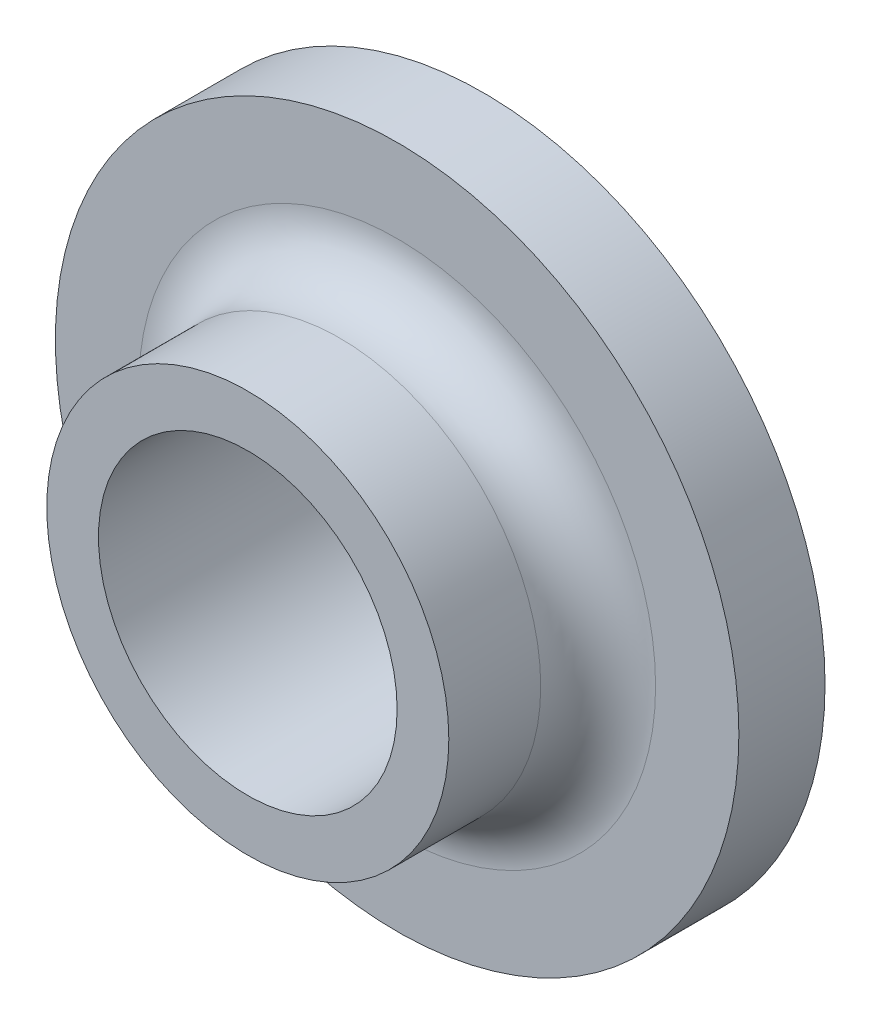
ISO-10303-21;
HEADER;
FILE_DESCRIPTION(('STEP AP214'),'2;1');
FILE_NAME('part.step','',(''),(''),'','','');
FILE_SCHEMA(('AUTOMOTIVE_DESIGN { 1 0 10303 214 1 1 1 1 }'));
ENDSEC;
DATA;
#1=APPLICATION_CONTEXT('core data for automotive mechanical design processes');
#2=APPLICATION_PROTOCOL_DEFINITION('international standard','automotive_design',2000,#1);
#3=PRODUCT_CONTEXT('',#1,'mechanical');
#4=PRODUCT('Part','Part','',(#3));
#5=PRODUCT_RELATED_PRODUCT_CATEGORY('part','',(#4));
#6=PRODUCT_DEFINITION_FORMATION('','',#4);
#7=PRODUCT_DEFINITION_CONTEXT('part definition',#1,'design');
#8=PRODUCT_DEFINITION('design','',#6,#7);
#9=PRODUCT_DEFINITION_SHAPE('','',#8);
#10=(LENGTH_UNIT() NAMED_UNIT(*) SI_UNIT(.MILLI.,.METRE.));
#11=(NAMED_UNIT(*) PLANE_ANGLE_UNIT() SI_UNIT($,.RADIAN.));
#12=(NAMED_UNIT(*) SI_UNIT($,.STERADIAN.) SOLID_ANGLE_UNIT());
#13=UNCERTAINTY_MEASURE_WITH_UNIT(LENGTH_MEASURE(1.E-05),#10,'distance_accuracy_value','');
#14=(GEOMETRIC_REPRESENTATION_CONTEXT(3) GLOBAL_UNCERTAINTY_ASSIGNED_CONTEXT((#13)) GLOBAL_UNIT_ASSIGNED_CONTEXT((#10,
#11,#12)) REPRESENTATION_CONTEXT('',''));
#15=CARTESIAN_POINT('',(0.,0.,0.));
#16=DIRECTION('',(0.,0.,1.));
#17=DIRECTION('',(1.,0.,0.));
#18=AXIS2_PLACEMENT_3D('',#15,#16,#17);
#19=CARTESIAN_POINT('',(0.,0.,1.5));
#20=DIRECTION('',(0.,0.,1.));
#21=DIRECTION('',(1.,0.,0.));
#22=AXIS2_PLACEMENT_3D('',#19,#20,#21);
#23=PLANE('',#22);
#24=CARTESIAN_POINT('',(0.,0.,1.5));
#25=DIRECTION('',(0.,0.,1.));
#26=DIRECTION('',(1.,0.,0.));
#27=AXIS2_PLACEMENT_3D('',#24,#25,#26);
#28=CIRCLE('',#27,4.5);
#29=CARTESIAN_POINT('',(4.5,0.,1.5));
#30=VERTEX_POINT('',#29);
#31=EDGE_CURVE('E10',#30,#30,#28,.F.);
#32=ORIENTED_EDGE('',*,*,#31,.T.);
#33=EDGE_LOOP('',(#32));
#34=FACE_BOUND('',#33,.T.);
#35=CARTESIAN_POINT('',(0.,0.,1.5));
#36=DIRECTION('',(0.,0.,1.));
#37=DIRECTION('',(1.,0.,0.));
#38=AXIS2_PLACEMENT_3D('',#35,#36,#37);
#39=CIRCLE('',#38,5.95);
#40=CARTESIAN_POINT('',(5.95,0.,1.5));
#41=VERTEX_POINT('',#40);
#42=EDGE_CURVE('E52',#41,#41,#39,.T.);
#43=ORIENTED_EDGE('',*,*,#42,.T.);
#44=EDGE_LOOP('',(#43));
#45=FACE_BOUND('',#44,.T.);
#46=ADVANCED_FACE('F41',(#34,#45),#23,.T.);
#47=CARTESIAN_POINT('',(0.,0.,0.));
#48=DIRECTION('',(0.,0.,1.));
#49=DIRECTION('',(1.,0.,0.));
#50=AXIS2_PLACEMENT_3D('',#47,#48,#49);
#51=PLANE('',#50);
#52=CARTESIAN_POINT('',(0.,0.,0.));
#53=DIRECTION('',(0.,0.,1.));
#54=DIRECTION('',(1.,0.,0.));
#55=AXIS2_PLACEMENT_3D('',#52,#53,#54);
#56=CIRCLE('',#55,2.6);
#57=CARTESIAN_POINT('',(2.6,0.,0.));
#58=VERTEX_POINT('',#57);
#59=EDGE_CURVE('E65',#58,#58,#56,.T.);
#60=ORIENTED_EDGE('',*,*,#59,.T.);
#61=EDGE_LOOP('',(#60));
#62=FACE_BOUND('',#61,.T.);
#63=CARTESIAN_POINT('',(0.,0.,0.));
#64=DIRECTION('',(0.,0.,1.));
#65=DIRECTION('',(1.,0.,0.));
#66=AXIS2_PLACEMENT_3D('',#63,#64,#65);
#67=CIRCLE('',#66,5.95);
#68=CARTESIAN_POINT('',(5.95,0.,0.));
#69=VERTEX_POINT('',#68);
#70=EDGE_CURVE('E56',#69,#69,#67,.T.);
#71=ORIENTED_EDGE('',*,*,#70,.F.);
#72=EDGE_LOOP('',(#71));
#73=FACE_BOUND('',#72,.T.);
#74=ADVANCED_FACE('F89',(#62,#73),#51,.F.);
#75=CARTESIAN_POINT('',(0.,0.,1.5));
#76=DIRECTION('',(0.,0.,-1.));
#77=DIRECTION('',(-1.,0.,0.));
#78=AXIS2_PLACEMENT_3D('',#75,#76,#77);
#79=CYLINDRICAL_SURFACE('',#78,5.95);
#80=ORIENTED_EDGE('',*,*,#42,.F.);
#81=EDGE_LOOP('',(#80));
#82=FACE_BOUND('',#81,.T.);
#83=ORIENTED_EDGE('',*,*,#70,.T.);
#84=EDGE_LOOP('',(#83));
#85=FACE_BOUND('',#84,.T.);
#86=ADVANCED_FACE('F82',(#82,#85),#79,.T.);
#87=CARTESIAN_POINT('',(0.,0.,4.1));
#88=DIRECTION('',(0.,0.,-1.));
#89=DIRECTION('',(-1.,0.,0.));
#90=AXIS2_PLACEMENT_3D('',#87,#88,#89);
#91=CYLINDRICAL_SURFACE('',#90,3.5);
#92=CARTESIAN_POINT('',(0.,0.,2.5));
#93=DIRECTION('',(0.,0.,1.));
#94=DIRECTION('',(1.,0.,0.));
#95=AXIS2_PLACEMENT_3D('',#92,#93,#94);
#96=CIRCLE('',#95,3.5);
#97=CARTESIAN_POINT('',(3.5,0.,2.5));
#98=VERTEX_POINT('',#97);
#99=EDGE_CURVE('E48',#98,#98,#96,.T.);
#100=ORIENTED_EDGE('',*,*,#99,.T.);
#101=EDGE_LOOP('',(#100));
#102=FACE_BOUND('',#101,.T.);
#103=CARTESIAN_POINT('',(0.,0.,4.1));
#104=DIRECTION('',(0.,0.,1.));
#105=DIRECTION('',(1.,0.,0.));
#106=AXIS2_PLACEMENT_3D('',#103,#104,#105);
#107=CIRCLE('',#106,3.5);
#108=CARTESIAN_POINT('',(3.5,0.,4.1));
#109=VERTEX_POINT('',#108);
#110=EDGE_CURVE('E60',#109,#109,#107,.T.);
#111=ORIENTED_EDGE('',*,*,#110,.F.);
#112=EDGE_LOOP('',(#111));
#113=FACE_BOUND('',#112,.T.);
#114=ADVANCED_FACE('F77',(#102,#113),#91,.T.);
#115=CARTESIAN_POINT('',(0.,0.,4.1));
#116=DIRECTION('',(0.,0.,1.));
#117=DIRECTION('',(1.,0.,0.));
#118=AXIS2_PLACEMENT_3D('',#115,#116,#117);
#119=PLANE('',#118);
#120=CARTESIAN_POINT('',(0.,0.,4.1));
#121=DIRECTION('',(0.,0.,1.));
#122=DIRECTION('',(1.,0.,0.));
#123=AXIS2_PLACEMENT_3D('',#120,#121,#122);
#124=CIRCLE('',#123,2.6);
#125=CARTESIAN_POINT('',(2.6,0.,4.1));
#126=VERTEX_POINT('',#125);
#127=EDGE_CURVE('E64',#126,#126,#124,.T.);
#128=ORIENTED_EDGE('',*,*,#127,.F.);
#129=EDGE_LOOP('',(#128));
#130=FACE_BOUND('',#129,.T.);
#131=ORIENTED_EDGE('',*,*,#110,.T.);
#132=EDGE_LOOP('',(#131));
#133=FACE_BOUND('',#132,.T.);
#134=ADVANCED_FACE('F74',(#130,#133),#119,.T.);
#135=CARTESIAN_POINT('',(0.,0.,4.1));
#136=DIRECTION('',(0.,0.,-1.));
#137=DIRECTION('',(-1.,0.,0.));
#138=AXIS2_PLACEMENT_3D('',#135,#136,#137);
#139=CYLINDRICAL_SURFACE('',#138,2.6);
#140=ORIENTED_EDGE('',*,*,#127,.T.);
#141=EDGE_LOOP('',(#140));
#142=FACE_BOUND('',#141,.T.);
#143=ORIENTED_EDGE('',*,*,#59,.F.);
#144=EDGE_LOOP('',(#143));
#145=FACE_BOUND('',#144,.T.);
#146=ADVANCED_FACE('F71',(#142,#145),#139,.F.);
#147=CARTESIAN_POINT('',(0.,0.,2.5));
#148=DIRECTION('',(0.,0.,1.));
#149=DIRECTION('',(1.,0.,0.));
#150=AXIS2_PLACEMENT_3D('',#147,#148,#149);
#151=TOROIDAL_SURFACE('',#150,4.5,1.);
#152=ORIENTED_EDGE('',*,*,#31,.F.);
#153=EDGE_LOOP('',(#152));
#154=FACE_BOUND('',#153,.T.);
#155=ORIENTED_EDGE('',*,*,#99,.F.);
#156=EDGE_LOOP('',(#155));
#157=FACE_BOUND('',#156,.T.);
#158=ADVANCED_FACE('F43',(#154,#157),#151,.F.);
#159=CLOSED_SHELL('',(#46,#74,#86,#114,#134,#146,#158));
#160=MANIFOLD_SOLID_BREP('B2',#159);
#161=ADVANCED_BREP_SHAPE_REPRESENTATION('',(#18,#160),#14);
#162=SHAPE_DEFINITION_REPRESENTATION(#9,#161);
ENDSEC;
END-ISO-10303-21;
